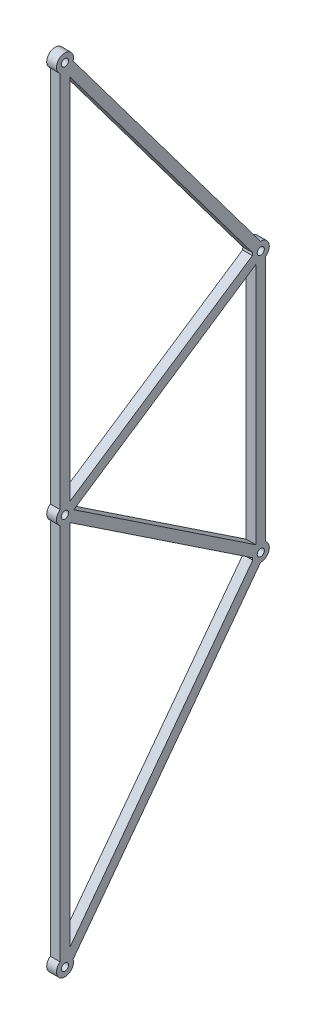
ISO-10303-21;
HEADER;
FILE_DESCRIPTION(('STEP AP214'),'2;1');
FILE_NAME('part.step','',(''),(''),'','','');
FILE_SCHEMA(('AUTOMOTIVE_DESIGN { 1 0 10303 214 1 1 1 1 }'));
ENDSEC;
DATA;
#1=APPLICATION_CONTEXT('core data for automotive mechanical design processes');
#2=APPLICATION_PROTOCOL_DEFINITION('international standard','automotive_design',2000,#1);
#3=PRODUCT_CONTEXT('',#1,'mechanical');
#4=PRODUCT('Part','Part','',(#3));
#5=PRODUCT_RELATED_PRODUCT_CATEGORY('part','',(#4));
#6=PRODUCT_DEFINITION_FORMATION('','',#4);
#7=PRODUCT_DEFINITION_CONTEXT('part definition',#1,'design');
#8=PRODUCT_DEFINITION('design','',#6,#7);
#9=PRODUCT_DEFINITION_SHAPE('','',#8);
#10=(LENGTH_UNIT() NAMED_UNIT(*) SI_UNIT(.MILLI.,.METRE.));
#11=(NAMED_UNIT(*) PLANE_ANGLE_UNIT() SI_UNIT($,.RADIAN.));
#12=(NAMED_UNIT(*) SI_UNIT($,.STERADIAN.) SOLID_ANGLE_UNIT());
#13=UNCERTAINTY_MEASURE_WITH_UNIT(LENGTH_MEASURE(1.E-05),#10,'distance_accuracy_value','');
#14=(GEOMETRIC_REPRESENTATION_CONTEXT(3) GLOBAL_UNCERTAINTY_ASSIGNED_CONTEXT((#13)) GLOBAL_UNIT_ASSIGNED_CONTEXT((#10,
#11,#12)) REPRESENTATION_CONTEXT('',''));
#15=CARTESIAN_POINT('',(0.,0.,0.));
#16=DIRECTION('',(0.,0.,1.));
#17=DIRECTION('',(1.,0.,0.));
#18=AXIS2_PLACEMENT_3D('',#15,#16,#17);
#19=CARTESIAN_POINT('',(15.,600.,307.5));
#20=DIRECTION('',(0.,0.,-1.));
#21=DIRECTION('',(-1.,0.,0.));
#22=AXIS2_PLACEMENT_3D('',#19,#20,#21);
#23=PLANE('',#22);
#24=DIRECTION('',(0.,-1.,0.));
#25=VECTOR('',#24,1.);
#26=CARTESIAN_POINT('',(15.,1222.5,307.5));
#27=LINE('',#26,#25);
#28=CARTESIAN_POINT('',(15.,1189.3816197092,307.5));
#29=VERTEX_POINT('',#28);
#30=CARTESIAN_POINT('',(15.,610.618380290798,307.5));
#31=VERTEX_POINT('',#30);
#32=EDGE_CURVE('E348',#29,#31,#27,.T.);
#33=ORIENTED_EDGE('',*,*,#32,.F.);
#34=DIRECTION('',(1.,0.,0.));
#35=VECTOR('',#34,1.);
#36=CARTESIAN_POINT('',(0.,1189.3816197092,307.5));
#37=LINE('',#36,#35);
#38=CARTESIAN_POINT('',(0.,1189.3816197092,307.5));
#39=VERTEX_POINT('',#38);
#40=EDGE_CURVE('E255',#29,#39,#37,.F.);
#41=ORIENTED_EDGE('',*,*,#40,.T.);
#42=DIRECTION('',(0.,-1.,0.));
#43=VECTOR('',#42,1.);
#44=CARTESIAN_POINT('',(0.,600.,307.5));
#45=LINE('',#44,#43);
#46=CARTESIAN_POINT('',(0.,610.618380290798,307.5));
#47=VERTEX_POINT('',#46);
#48=EDGE_CURVE('E363',#39,#47,#45,.T.);
#49=ORIENTED_EDGE('',*,*,#48,.T.);
#50=DIRECTION('',(1.,0.,0.));
#51=VECTOR('',#50,1.);
#52=CARTESIAN_POINT('',(0.,610.618380290798,307.5));
#53=LINE('',#52,#51);
#54=EDGE_CURVE('E11',#47,#31,#53,.T.);
#55=ORIENTED_EDGE('',*,*,#54,.T.);
#56=EDGE_LOOP('',(#33,#41,#49,#55));
#57=FACE_BOUND('',#56,.T.);
#58=ADVANCED_FACE('F45',(#57),#23,.F.);
#59=CARTESIAN_POINT('',(15.,589.381619709202,307.5));
#60=VERTEX_POINT('',#59);
#61=CARTESIAN_POINT('',(15.,10.6183802907976,307.5));
#62=VERTEX_POINT('',#61);
#63=EDGE_CURVE('E345',#60,#62,#27,.T.);
#64=ORIENTED_EDGE('',*,*,#63,.F.);
#65=DIRECTION('',(1.,0.,0.));
#66=VECTOR('',#65,1.);
#67=CARTESIAN_POINT('',(0.,589.381619709202,307.5));
#68=LINE('',#67,#66);
#69=CARTESIAN_POINT('',(0.,589.381619709202,307.5));
#70=VERTEX_POINT('',#69);
#71=EDGE_CURVE('E53',#60,#70,#68,.F.);
#72=ORIENTED_EDGE('',*,*,#71,.T.);
#73=CARTESIAN_POINT('',(0.,10.6183802907976,307.5));
#74=VERTEX_POINT('',#73);
#75=EDGE_CURVE('E344',#70,#74,#45,.T.);
#76=ORIENTED_EDGE('',*,*,#75,.T.);
#77=DIRECTION('',(1.,0.,0.));
#78=VECTOR('',#77,1.);
#79=CARTESIAN_POINT('',(0.,10.6183802907976,307.5));
#80=LINE('',#79,#78);
#81=EDGE_CURVE('E259',#74,#62,#80,.T.);
#82=ORIENTED_EDGE('',*,*,#81,.T.);
#83=EDGE_LOOP('',(#64,#72,#76,#82));
#84=FACE_BOUND('',#83,.T.);
#85=ADVANCED_FACE('F390',(#84),#23,.F.);
#86=CARTESIAN_POINT('',(15.,804.5,-6.));
#87=DIRECTION('',(0.,-0.6,0.8));
#88=DIRECTION('',(0.,-0.8,-0.6));
#89=AXIS2_PLACEMENT_3D('',#86,#87,#88);
#90=PLANE('',#89);
#91=DIRECTION('',(0.,0.8,0.6));
#92=VECTOR('',#91,1.);
#93=CARTESIAN_POINT('',(0.,804.5,-6.));
#94=LINE('',#93,#92);
#95=CARTESIAN_POINT('',(0.,812.994704232638,0.371028174478654));
#96=VERTEX_POINT('',#95);
#97=CARTESIAN_POINT('',(0.,1196.00529576736,287.628971825522));
#98=VERTEX_POINT('',#97);
#99=EDGE_CURVE('E349',#96,#98,#94,.T.);
#100=ORIENTED_EDGE('',*,*,#99,.T.);
#101=DIRECTION('',(1.,0.,0.));
#102=VECTOR('',#101,1.);
#103=CARTESIAN_POINT('',(0.,1196.00529576736,287.628971825522));
#104=LINE('',#103,#102);
#105=CARTESIAN_POINT('',(15.,1196.00529576736,287.628971825522));
#106=VERTEX_POINT('',#105);
#107=EDGE_CURVE('E378',#98,#106,#104,.T.);
#108=ORIENTED_EDGE('',*,*,#107,.T.);
#109=DIRECTION('',(0.,0.8,0.6));
#110=VECTOR('',#109,1.);
#111=CARTESIAN_POINT('',(15.,804.5,-6.));
#112=LINE('',#111,#110);
#113=CARTESIAN_POINT('',(15.,812.994704232638,0.371028174478655));
#114=VERTEX_POINT('',#113);
#115=EDGE_CURVE('E212',#114,#106,#112,.T.);
#116=ORIENTED_EDGE('',*,*,#115,.F.);
#117=DIRECTION('',(1.,0.,0.));
#118=VECTOR('',#117,1.);
#119=CARTESIAN_POINT('',(0.,812.994704232638,0.371028174478661));
#120=LINE('',#119,#118);
#121=EDGE_CURVE('E234',#114,#96,#120,.F.);
#122=ORIENTED_EDGE('',*,*,#121,.T.);
#123=EDGE_LOOP('',(#100,#108,#116,#122));
#124=FACE_BOUND('',#123,.T.);
#125=ADVANCED_FACE('F454',(#124),#90,.F.);
#126=CARTESIAN_POINT('',(15.,400.,0.));
#127=DIRECTION('',(1.,0.,0.));
#128=DIRECTION('',(0.,0.,-1.));
#129=AXIS2_PLACEMENT_3D('',#126,#127,#128);
#130=PLANE('',#129);
#131=CARTESIAN_POINT('',(15.,0.,300.));
#132=DIRECTION('',(1.,0.,0.));
#133=DIRECTION('',(0.,0.,-1.));
#134=AXIS2_PLACEMENT_3D('',#131,#132,#133);
#135=CIRCLE('',#134,5.5);
#136=CARTESIAN_POINT('',(15.,0.,294.5));
#137=VERTEX_POINT('',#136);
#138=EDGE_CURVE('E498',#137,#137,#135,.T.);
#139=ORIENTED_EDGE('',*,*,#138,.F.);
#140=EDGE_LOOP('',(#139));
#141=FACE_BOUND('',#140,.T.);
#142=CARTESIAN_POINT('',(15.,600.,300.));
#143=DIRECTION('',(1.,0.,0.));
#144=DIRECTION('',(0.,0.,-1.));
#145=AXIS2_PLACEMENT_3D('',#142,#143,#144);
#146=CIRCLE('',#145,5.49999999999996);
#147=CARTESIAN_POINT('',(15.,600.,294.5));
#148=VERTEX_POINT('',#147);
#149=EDGE_CURVE('E494',#148,#148,#146,.T.);
#150=ORIENTED_EDGE('',*,*,#149,.F.);
#151=EDGE_LOOP('',(#150));
#152=FACE_BOUND('',#151,.T.);
#153=CARTESIAN_POINT('',(15.,1200.,300.));
#154=DIRECTION('',(1.,0.,0.));
#155=DIRECTION('',(0.,0.,-1.));
#156=AXIS2_PLACEMENT_3D('',#153,#154,#155);
#157=CIRCLE('',#156,5.50000000000007);
#158=CARTESIAN_POINT('',(15.,1200.,294.5));
#159=VERTEX_POINT('',#158);
#160=EDGE_CURVE('E486',#159,#159,#157,.T.);
#161=ORIENTED_EDGE('',*,*,#160,.F.);
#162=EDGE_LOOP('',(#161));
#163=FACE_BOUND('',#162,.T.);
#164=CARTESIAN_POINT('',(15.,800.,0.));
#165=DIRECTION('',(1.,0.,0.));
#166=DIRECTION('',(0.,0.,-1.));
#167=AXIS2_PLACEMENT_3D('',#164,#165,#166);
#168=CIRCLE('',#167,5.49999999999996);
#169=CARTESIAN_POINT('',(15.,800.,-5.49999999999996));
#170=VERTEX_POINT('',#169);
#171=EDGE_CURVE('E478',#170,#170,#168,.T.);
#172=ORIENTED_EDGE('',*,*,#171,.F.);
#173=EDGE_LOOP('',(#172));
#174=FACE_BOUND('',#173,.T.);
#175=CARTESIAN_POINT('',(15.,400.,0.));
#176=DIRECTION('',(1.,0.,0.));
#177=DIRECTION('',(0.,0.,-1.));
#178=AXIS2_PLACEMENT_3D('',#175,#176,#177);
#179=CIRCLE('',#178,5.50000000000002);
#180=CARTESIAN_POINT('',(15.,400.,-5.50000000000002));
#181=VERTEX_POINT('',#180);
#182=EDGE_CURVE('E470',#181,#181,#179,.T.);
#183=ORIENTED_EDGE('',*,*,#182,.F.);
#184=EDGE_LOOP('',(#183));
#185=FACE_BOUND('',#184,.T.);
#186=CARTESIAN_POINT('',(15.,0.,300.));
#187=DIRECTION('',(1.,0.,0.));
#188=DIRECTION('',(0.,0.,-1.));
#189=AXIS2_PLACEMENT_3D('',#186,#187,#188);
#190=CIRCLE('',#189,13.);
#191=CARTESIAN_POINT('',(15.,3.99470423263813,287.628971825521));
#192=VERTEX_POINT('',#191);
#193=EDGE_CURVE('E406',#62,#192,#190,.T.);
#194=ORIENTED_EDGE('',*,*,#193,.T.);
#195=DIRECTION('',(0.,0.8,-0.6));
#196=VECTOR('',#195,1.);
#197=CARTESIAN_POINT('',(15.,-22.5,307.5));
#198=LINE('',#197,#196);
#199=CARTESIAN_POINT('',(15.,387.005295767362,0.371028174478605));
#200=VERTEX_POINT('',#199);
#201=EDGE_CURVE('E350',#192,#200,#198,.T.);
#202=ORIENTED_EDGE('',*,*,#201,.T.);
#203=CARTESIAN_POINT('',(15.,400.,0.));
#204=DIRECTION('',(1.,0.,0.));
#205=DIRECTION('',(0.,0.,-1.));
#206=AXIS2_PLACEMENT_3D('',#203,#204,#205);
#207=CIRCLE('',#206,13.);
#208=CARTESIAN_POINT('',(15.,410.618380290798,-7.5));
#209=VERTEX_POINT('',#208);
#210=EDGE_CURVE('E413',#200,#209,#207,.T.);
#211=ORIENTED_EDGE('',*,*,#210,.T.);
#212=DIRECTION('',(0.,1.,0.));
#213=VECTOR('',#212,1.);
#214=CARTESIAN_POINT('',(15.,400.,-7.5));
#215=LINE('',#214,#213);
#216=CARTESIAN_POINT('',(15.,789.381619709202,-7.5));
#217=VERTEX_POINT('',#216);
#218=EDGE_CURVE('E354',#209,#217,#215,.T.);
#219=ORIENTED_EDGE('',*,*,#218,.T.);
#220=CARTESIAN_POINT('',(15.,800.,0.));
#221=DIRECTION('',(1.,0.,0.));
#222=DIRECTION('',(0.,0.,-1.));
#223=AXIS2_PLACEMENT_3D('',#220,#221,#222);
#224=CIRCLE('',#223,13.);
#225=EDGE_CURVE('E219',#217,#114,#224,.T.);
#226=ORIENTED_EDGE('',*,*,#225,.T.);
#227=ORIENTED_EDGE('',*,*,#115,.T.);
#228=CARTESIAN_POINT('',(15.,1200.,300.));
#229=DIRECTION('',(1.,0.,0.));
#230=DIRECTION('',(0.,0.,-1.));
#231=AXIS2_PLACEMENT_3D('',#228,#229,#230);
#232=CIRCLE('',#231,12.9999999999998);
#233=EDGE_CURVE('E66',#106,#29,#232,.T.);
#234=ORIENTED_EDGE('',*,*,#233,.T.);
#235=ORIENTED_EDGE('',*,*,#32,.T.);
#236=CARTESIAN_POINT('',(15.,600.,300.));
#237=DIRECTION('',(1.,0.,0.));
#238=DIRECTION('',(0.,0.,-1.));
#239=AXIS2_PLACEMENT_3D('',#236,#237,#238);
#240=CIRCLE('',#239,13.);
#241=EDGE_CURVE('E60',#31,#60,#240,.T.);
#242=ORIENTED_EDGE('',*,*,#241,.T.);
#243=ORIENTED_EDGE('',*,*,#63,.T.);
#244=EDGE_LOOP('',(#194,#202,#211,#219,#226,#227,#234,#235,#242,#243));
#245=FACE_BOUND('',#244,.T.);
#246=DIRECTION('',(0.,0.554700196225229,0.832050294337844));
#247=VECTOR('',#246,1.);
#248=CARTESIAN_POINT('',(15.,398.157414540893,10.75693909433));
#249=LINE('',#248,#247);
#250=CARTESIAN_POINT('',(15.,399.649640423366,12.9952779180386));
#251=VERTEX_POINT('',#250);
#252=CARTESIAN_POINT('',(15.,585.98612181134,292.5));
#253=VERTEX_POINT('',#252);
#254=EDGE_CURVE('E287',#251,#253,#249,.T.);
#255=ORIENTED_EDGE('',*,*,#254,.F.);
#256=CARTESIAN_POINT('',(15.,396.005295767362,12.3710281744786));
#257=VERTEX_POINT('',#256);
#258=EDGE_CURVE('E407',#251,#257,#207,.T.);
#259=ORIENTED_EDGE('',*,*,#258,.T.);
#260=DIRECTION('',(0.,0.8,-0.6));
#261=VECTOR('',#260,1.);
#262=CARTESIAN_POINT('',(15.,22.5,292.5));
#263=LINE('',#262,#261);
#264=CARTESIAN_POINT('',(15.,22.5,292.5));
#265=VERTEX_POINT('',#264);
#266=EDGE_CURVE('E284',#265,#257,#263,.T.);
#267=ORIENTED_EDGE('',*,*,#266,.F.);
#268=DIRECTION('',(0.,-1.,0.));
#269=VECTOR('',#268,1.);
#270=CARTESIAN_POINT('',(15.,585.98612181134,292.5));
#271=LINE('',#270,#269);
#272=EDGE_CURVE('E291',#253,#265,#271,.T.);
#273=ORIENTED_EDGE('',*,*,#272,.F.);
#274=EDGE_LOOP('',(#255,#259,#267,#273));
#275=FACE_BOUND('',#274,.T.);
#276=DIRECTION('',(0.,0.8,0.6));
#277=VECTOR('',#276,1.);
#278=CARTESIAN_POINT('',(15.,801.842585459107,10.7569390943299));
#279=LINE('',#278,#277);
#280=CARTESIAN_POINT('',(15.,803.994704232638,12.3710281744786));
#281=VERTEX_POINT('',#280);
#282=CARTESIAN_POINT('',(15.,1177.5,292.5));
#283=VERTEX_POINT('',#282);
#284=EDGE_CURVE('E188',#281,#283,#279,.T.);
#285=ORIENTED_EDGE('',*,*,#284,.F.);
#286=CARTESIAN_POINT('',(15.,800.350359576634,12.9952779180386));
#287=VERTEX_POINT('',#286);
#288=EDGE_CURVE('E194',#281,#287,#224,.T.);
#289=ORIENTED_EDGE('',*,*,#288,.T.);
#290=DIRECTION('',(0.,0.554700196225229,-0.832050294337844));
#291=VECTOR('',#290,1.);
#292=CARTESIAN_POINT('',(15.,801.842585459107,10.7569390943299));
#293=LINE('',#292,#291);
#294=CARTESIAN_POINT('',(15.,614.01387818866,292.5));
#295=VERTEX_POINT('',#294);
#296=EDGE_CURVE('E201',#295,#287,#293,.T.);
#297=ORIENTED_EDGE('',*,*,#296,.F.);
#298=DIRECTION('',(0.,-1.,0.));
#299=VECTOR('',#298,1.);
#300=CARTESIAN_POINT('',(15.,1177.5,292.5));
#301=LINE('',#300,#299);
#302=EDGE_CURVE('E195',#283,#295,#301,.T.);
#303=ORIENTED_EDGE('',*,*,#302,.F.);
#304=EDGE_LOOP('',(#285,#289,#297,#303));
#305=FACE_BOUND('',#304,.T.);
#306=DIRECTION('',(0.,-0.55470019622523,0.832050294337843));
#307=VECTOR('',#306,1.);
#308=CARTESIAN_POINT('',(15.,785.98612181134,7.49999999999998));
#309=LINE('',#308,#307);
#310=CARTESIAN_POINT('',(15.,785.98612181134,7.49999999999998));
#311=VERTEX_POINT('',#310);
#312=CARTESIAN_POINT('',(15.,600.,286.47918271701));
#313=VERTEX_POINT('',#312);
#314=EDGE_CURVE('E315',#311,#313,#309,.T.);
#315=ORIENTED_EDGE('',*,*,#314,.F.);
#316=DIRECTION('',(0.,1.,0.));
#317=VECTOR('',#316,1.);
#318=CARTESIAN_POINT('',(15.,414.01387818866,7.5));
#319=LINE('',#318,#317);
#320=CARTESIAN_POINT('',(15.,414.01387818866,7.5));
#321=VERTEX_POINT('',#320);
#322=EDGE_CURVE('E312',#321,#311,#319,.T.);
#323=ORIENTED_EDGE('',*,*,#322,.F.);
#324=DIRECTION('',(0.,-0.554700196225229,-0.832050294337844));
#325=VECTOR('',#324,1.);
#326=CARTESIAN_POINT('',(15.,414.01387818866,7.5));
#327=LINE('',#326,#325);
#328=EDGE_CURVE('E320',#313,#321,#327,.T.);
#329=ORIENTED_EDGE('',*,*,#328,.F.);
#330=EDGE_LOOP('',(#315,#323,#329));
#331=FACE_BOUND('',#330,.T.);
#332=ADVANCED_FACE('F190',(#141,#152,#163,#174,#185,#245,#275,#305,#331),#130,.T.);
#333=CARTESIAN_POINT('',(0.,400.,0.));
#334=DIRECTION('',(1.,0.,0.));
#335=DIRECTION('',(0.,0.,-1.));
#336=AXIS2_PLACEMENT_3D('',#333,#334,#335);
#337=PLANE('',#336);
#338=CARTESIAN_POINT('',(0.,0.,300.));
#339=DIRECTION('',(1.,0.,0.));
#340=DIRECTION('',(0.,0.,-1.));
#341=AXIS2_PLACEMENT_3D('',#338,#339,#340);
#342=CIRCLE('',#341,5.5);
#343=CARTESIAN_POINT('',(0.,0.,294.5));
#344=VERTEX_POINT('',#343);
#345=EDGE_CURVE('E231',#344,#344,#342,.T.);
#346=ORIENTED_EDGE('',*,*,#345,.T.);
#347=EDGE_LOOP('',(#346));
#348=FACE_BOUND('',#347,.T.);
#349=CARTESIAN_POINT('',(0.,600.,300.));
#350=DIRECTION('',(1.,0.,0.));
#351=DIRECTION('',(0.,0.,-1.));
#352=AXIS2_PLACEMENT_3D('',#349,#350,#351);
#353=CIRCLE('',#352,5.49999999999996);
#354=CARTESIAN_POINT('',(0.,600.,294.5));
#355=VERTEX_POINT('',#354);
#356=EDGE_CURVE('E490',#355,#355,#353,.T.);
#357=ORIENTED_EDGE('',*,*,#356,.T.);
#358=EDGE_LOOP('',(#357));
#359=FACE_BOUND('',#358,.T.);
#360=CARTESIAN_POINT('',(0.,1200.,300.));
#361=DIRECTION('',(1.,0.,0.));
#362=DIRECTION('',(0.,0.,-1.));
#363=AXIS2_PLACEMENT_3D('',#360,#361,#362);
#364=CIRCLE('',#363,5.50000000000007);
#365=CARTESIAN_POINT('',(0.,1200.,294.5));
#366=VERTEX_POINT('',#365);
#367=EDGE_CURVE('E482',#366,#366,#364,.T.);
#368=ORIENTED_EDGE('',*,*,#367,.T.);
#369=EDGE_LOOP('',(#368));
#370=FACE_BOUND('',#369,.T.);
#371=CARTESIAN_POINT('',(0.,800.,0.));
#372=DIRECTION('',(1.,0.,0.));
#373=DIRECTION('',(0.,0.,-1.));
#374=AXIS2_PLACEMENT_3D('',#371,#372,#373);
#375=CIRCLE('',#374,5.49999999999996);
#376=CARTESIAN_POINT('',(0.,800.,-5.49999999999996));
#377=VERTEX_POINT('',#376);
#378=EDGE_CURVE('E474',#377,#377,#375,.T.);
#379=ORIENTED_EDGE('',*,*,#378,.T.);
#380=EDGE_LOOP('',(#379));
#381=FACE_BOUND('',#380,.T.);
#382=CARTESIAN_POINT('',(0.,400.,0.));
#383=DIRECTION('',(1.,0.,0.));
#384=DIRECTION('',(0.,0.,-1.));
#385=AXIS2_PLACEMENT_3D('',#382,#383,#384);
#386=CIRCLE('',#385,5.50000000000002);
#387=CARTESIAN_POINT('',(0.,400.,-5.50000000000002));
#388=VERTEX_POINT('',#387);
#389=EDGE_CURVE('E466',#388,#388,#386,.T.);
#390=ORIENTED_EDGE('',*,*,#389,.T.);
#391=EDGE_LOOP('',(#390));
#392=FACE_BOUND('',#391,.T.);
#393=DIRECTION('',(0.,0.8,-0.6));
#394=VECTOR('',#393,1.);
#395=CARTESIAN_POINT('',(0.,-22.5,307.5));
#396=LINE('',#395,#394);
#397=CARTESIAN_POINT('',(0.,3.99470423263812,287.628971825521));
#398=VERTEX_POINT('',#397);
#399=CARTESIAN_POINT('',(0.,387.005295767362,0.371028174478605));
#400=VERTEX_POINT('',#399);
#401=EDGE_CURVE('E364',#398,#400,#396,.T.);
#402=ORIENTED_EDGE('',*,*,#401,.F.);
#403=CARTESIAN_POINT('',(0.,0.,300.));
#404=DIRECTION('',(1.,0.,0.));
#405=DIRECTION('',(0.,0.,-1.));
#406=AXIS2_PLACEMENT_3D('',#403,#404,#405);
#407=CIRCLE('',#406,13.);
#408=EDGE_CURVE('E401',#74,#398,#407,.T.);
#409=ORIENTED_EDGE('',*,*,#408,.F.);
#410=ORIENTED_EDGE('',*,*,#75,.F.);
#411=CARTESIAN_POINT('',(0.,600.,300.));
#412=DIRECTION('',(1.,0.,0.));
#413=DIRECTION('',(0.,0.,-1.));
#414=AXIS2_PLACEMENT_3D('',#411,#412,#413);
#415=CIRCLE('',#414,13.);
#416=EDGE_CURVE('E399',#47,#70,#415,.T.);
#417=ORIENTED_EDGE('',*,*,#416,.F.);
#418=ORIENTED_EDGE('',*,*,#48,.F.);
#419=CARTESIAN_POINT('',(0.,1200.,300.));
#420=DIRECTION('',(1.,0.,0.));
#421=DIRECTION('',(0.,0.,-1.));
#422=AXIS2_PLACEMENT_3D('',#419,#420,#421);
#423=CIRCLE('',#422,12.9999999999998);
#424=EDGE_CURVE('E235',#98,#39,#423,.T.);
#425=ORIENTED_EDGE('',*,*,#424,.F.);
#426=ORIENTED_EDGE('',*,*,#99,.F.);
#427=CARTESIAN_POINT('',(0.,800.,0.));
#428=DIRECTION('',(1.,0.,0.));
#429=DIRECTION('',(0.,0.,-1.));
#430=AXIS2_PLACEMENT_3D('',#427,#428,#429);
#431=CIRCLE('',#430,13.);
#432=CARTESIAN_POINT('',(0.,789.381619709202,-7.5));
#433=VERTEX_POINT('',#432);
#434=EDGE_CURVE('E228',#433,#96,#431,.T.);
#435=ORIENTED_EDGE('',*,*,#434,.F.);
#436=DIRECTION('',(0.,1.,0.));
#437=VECTOR('',#436,1.);
#438=CARTESIAN_POINT('',(0.,400.,-7.5));
#439=LINE('',#438,#437);
#440=CARTESIAN_POINT('',(0.,410.618380290798,-7.5));
#441=VERTEX_POINT('',#440);
#442=EDGE_CURVE('E368',#441,#433,#439,.T.);
#443=ORIENTED_EDGE('',*,*,#442,.F.);
#444=CARTESIAN_POINT('',(0.,400.,0.));
#445=DIRECTION('',(1.,0.,0.));
#446=DIRECTION('',(0.,0.,-1.));
#447=AXIS2_PLACEMENT_3D('',#444,#445,#446);
#448=CIRCLE('',#447,13.);
#449=EDGE_CURVE('E218',#400,#441,#448,.T.);
#450=ORIENTED_EDGE('',*,*,#449,.F.);
#451=EDGE_LOOP('',(#402,#409,#410,#417,#418,#425,#426,#435,#443,#450));
#452=FACE_BOUND('',#451,.T.);
#453=CARTESIAN_POINT('',(0.,399.649640423366,12.9952779180386));
#454=VERTEX_POINT('',#453);
#455=CARTESIAN_POINT('',(0.,396.005295767362,12.3710281744786));
#456=VERTEX_POINT('',#455);
#457=EDGE_CURVE('E223',#454,#456,#448,.T.);
#458=ORIENTED_EDGE('',*,*,#457,.F.);
#459=DIRECTION('',(0.,0.554700196225229,0.832050294337844));
#460=VECTOR('',#459,1.);
#461=CARTESIAN_POINT('',(0.,398.157414540893,10.75693909433));
#462=LINE('',#461,#460);
#463=CARTESIAN_POINT('',(0.,585.98612181134,292.5));
#464=VERTEX_POINT('',#463);
#465=EDGE_CURVE('E298',#454,#464,#462,.T.);
#466=ORIENTED_EDGE('',*,*,#465,.T.);
#467=DIRECTION('',(0.,-1.,0.));
#468=VECTOR('',#467,1.);
#469=CARTESIAN_POINT('',(0.,585.98612181134,292.5));
#470=LINE('',#469,#468);
#471=CARTESIAN_POINT('',(0.,22.5,292.5));
#472=VERTEX_POINT('',#471);
#473=EDGE_CURVE('E288',#464,#472,#470,.T.);
#474=ORIENTED_EDGE('',*,*,#473,.T.);
#475=DIRECTION('',(0.,0.8,-0.6));
#476=VECTOR('',#475,1.);
#477=CARTESIAN_POINT('',(0.,22.5,292.5));
#478=LINE('',#477,#476);
#479=EDGE_CURVE('E283',#472,#456,#478,.T.);
#480=ORIENTED_EDGE('',*,*,#479,.T.);
#481=EDGE_LOOP('',(#458,#466,#474,#480));
#482=FACE_BOUND('',#481,.T.);
#483=CARTESIAN_POINT('',(0.,803.994704232638,12.3710281744786));
#484=VERTEX_POINT('',#483);
#485=CARTESIAN_POINT('',(0.,800.350359576634,12.9952779180386));
#486=VERTEX_POINT('',#485);
#487=EDGE_CURVE('E225',#484,#486,#431,.T.);
#488=ORIENTED_EDGE('',*,*,#487,.F.);
#489=DIRECTION('',(0.,0.8,0.6));
#490=VECTOR('',#489,1.);
#491=CARTESIAN_POINT('',(0.,801.842585459107,10.7569390943299));
#492=LINE('',#491,#490);
#493=CARTESIAN_POINT('',(0.,1177.5,292.5));
#494=VERTEX_POINT('',#493);
#495=EDGE_CURVE('E206',#484,#494,#492,.T.);
#496=ORIENTED_EDGE('',*,*,#495,.T.);
#497=DIRECTION('',(0.,-1.,0.));
#498=VECTOR('',#497,1.);
#499=CARTESIAN_POINT('',(0.,1177.5,292.5));
#500=LINE('',#499,#498);
#501=CARTESIAN_POINT('',(0.,614.01387818866,292.5));
#502=VERTEX_POINT('',#501);
#503=EDGE_CURVE('E263',#494,#502,#500,.T.);
#504=ORIENTED_EDGE('',*,*,#503,.T.);
#505=DIRECTION('',(0.,0.554700196225229,-0.832050294337844));
#506=VECTOR('',#505,1.);
#507=CARTESIAN_POINT('',(0.,801.842585459107,10.7569390943299));
#508=LINE('',#507,#506);
#509=EDGE_CURVE('E271',#502,#486,#508,.T.);
#510=ORIENTED_EDGE('',*,*,#509,.T.);
#511=EDGE_LOOP('',(#488,#496,#504,#510));
#512=FACE_BOUND('',#511,.T.);
#513=DIRECTION('',(0.,1.,0.));
#514=VECTOR('',#513,1.);
#515=CARTESIAN_POINT('',(0.,414.01387818866,7.5));
#516=LINE('',#515,#514);
#517=CARTESIAN_POINT('',(0.,414.01387818866,7.5));
#518=VERTEX_POINT('',#517);
#519=CARTESIAN_POINT('',(0.,785.98612181134,7.49999999999998));
#520=VERTEX_POINT('',#519);
#521=EDGE_CURVE('E311',#518,#520,#516,.T.);
#522=ORIENTED_EDGE('',*,*,#521,.T.);
#523=DIRECTION('',(0.,-0.55470019622523,0.832050294337843));
#524=VECTOR('',#523,1.);
#525=CARTESIAN_POINT('',(0.,785.98612181134,7.49999999999998));
#526=LINE('',#525,#524);
#527=CARTESIAN_POINT('',(0.,600.,286.47918271701));
#528=VERTEX_POINT('',#527);
#529=EDGE_CURVE('E327',#520,#528,#526,.T.);
#530=ORIENTED_EDGE('',*,*,#529,.T.);
#531=DIRECTION('',(0.,-0.554700196225229,-0.832050294337844));
#532=VECTOR('',#531,1.);
#533=CARTESIAN_POINT('',(0.,414.01387818866,7.5));
#534=LINE('',#533,#532);
#535=EDGE_CURVE('E316',#528,#518,#534,.T.);
#536=ORIENTED_EDGE('',*,*,#535,.T.);
#537=EDGE_LOOP('',(#522,#530,#536));
#538=FACE_BOUND('',#537,.T.);
#539=ADVANCED_FACE('F396',(#348,#359,#370,#381,#392,#452,#482,#512,#538),#337,.F.);
#540=CARTESIAN_POINT('',(15.,-22.5,307.5));
#541=DIRECTION('',(0.,0.6,0.8));
#542=DIRECTION('',(0.,-0.8,0.6));
#543=AXIS2_PLACEMENT_3D('',#540,#541,#542);
#544=PLANE('',#543);
#545=ORIENTED_EDGE('',*,*,#201,.F.);
#546=DIRECTION('',(1.,0.,0.));
#547=VECTOR('',#546,1.);
#548=CARTESIAN_POINT('',(0.,3.99470423263812,287.628971825521));
#549=LINE('',#548,#547);
#550=EDGE_CURVE('E382',#192,#398,#549,.F.);
#551=ORIENTED_EDGE('',*,*,#550,.T.);
#552=ORIENTED_EDGE('',*,*,#401,.T.);
#553=DIRECTION('',(1.,0.,0.));
#554=VECTOR('',#553,1.);
#555=CARTESIAN_POINT('',(0.,387.005295767362,0.371028174478605));
#556=LINE('',#555,#554);
#557=EDGE_CURVE('E251',#400,#200,#556,.T.);
#558=ORIENTED_EDGE('',*,*,#557,.T.);
#559=EDGE_LOOP('',(#545,#551,#552,#558));
#560=FACE_BOUND('',#559,.T.);
#561=ADVANCED_FACE('F528',(#560),#544,.F.);
#562=CARTESIAN_POINT('',(15.,400.,-7.5));
#563=DIRECTION('',(0.,0.,1.));
#564=DIRECTION('',(1.,0.,0.));
#565=AXIS2_PLACEMENT_3D('',#562,#563,#564);
#566=PLANE('',#565);
#567=ORIENTED_EDGE('',*,*,#218,.F.);
#568=DIRECTION('',(1.,0.,0.));
#569=VECTOR('',#568,1.);
#570=CARTESIAN_POINT('',(0.,410.618380290798,-7.5));
#571=LINE('',#570,#569);
#572=EDGE_CURVE('E247',#209,#441,#571,.F.);
#573=ORIENTED_EDGE('',*,*,#572,.T.);
#574=ORIENTED_EDGE('',*,*,#442,.T.);
#575=DIRECTION('',(1.,0.,0.));
#576=VECTOR('',#575,1.);
#577=CARTESIAN_POINT('',(0.,789.381619709202,-7.5));
#578=LINE('',#577,#576);
#579=EDGE_CURVE('E239',#433,#217,#578,.T.);
#580=ORIENTED_EDGE('',*,*,#579,.T.);
#581=EDGE_LOOP('',(#567,#573,#574,#580));
#582=FACE_BOUND('',#581,.T.);
#583=ADVANCED_FACE('F536',(#582),#566,.F.);
#584=CARTESIAN_POINT('',(15.,414.01387818866,7.5));
#585=DIRECTION('',(0.,0.,1.));
#586=DIRECTION('',(0.,-1.,0.));
#587=AXIS2_PLACEMENT_3D('',#584,#585,#586);
#588=PLANE('',#587);
#589=ORIENTED_EDGE('',*,*,#521,.F.);
#590=DIRECTION('',(-1.,0.,0.));
#591=VECTOR('',#590,1.);
#592=CARTESIAN_POINT('',(15.,414.01387818866,7.5));
#593=LINE('',#592,#591);
#594=EDGE_CURVE('E323',#321,#518,#593,.T.);
#595=ORIENTED_EDGE('',*,*,#594,.F.);
#596=ORIENTED_EDGE('',*,*,#322,.T.);
#597=DIRECTION('',(-1.,0.,0.));
#598=VECTOR('',#597,1.);
#599=CARTESIAN_POINT('',(15.,785.98612181134,7.49999999999998));
#600=LINE('',#599,#598);
#601=EDGE_CURVE('E340',#311,#520,#600,.T.);
#602=ORIENTED_EDGE('',*,*,#601,.T.);
#603=EDGE_LOOP('',(#589,#595,#596,#602));
#604=FACE_BOUND('',#603,.T.);
#605=ADVANCED_FACE('F582',(#604),#588,.T.);
#606=CARTESIAN_POINT('',(15.,785.98612181134,7.49999999999998));
#607=DIRECTION('',(0.,-0.832050294337843,-0.55470019622523));
#608=DIRECTION('',(0.,0.55470019622523,-0.832050294337843));
#609=AXIS2_PLACEMENT_3D('',#606,#607,#608);
#610=PLANE('',#609);
#611=ORIENTED_EDGE('',*,*,#529,.F.);
#612=ORIENTED_EDGE('',*,*,#601,.F.);
#613=ORIENTED_EDGE('',*,*,#314,.T.);
#614=DIRECTION('',(-1.,0.,0.));
#615=VECTOR('',#614,1.);
#616=CARTESIAN_POINT('',(15.,600.,286.47918271701));
#617=LINE('',#616,#615);
#618=EDGE_CURVE('E337',#313,#528,#617,.T.);
#619=ORIENTED_EDGE('',*,*,#618,.T.);
#620=EDGE_LOOP('',(#611,#612,#613,#619));
#621=FACE_BOUND('',#620,.T.);
#622=ADVANCED_FACE('F589',(#621),#610,.T.);
#623=CARTESIAN_POINT('',(15.,414.01387818866,7.5));
#624=DIRECTION('',(0.,0.832050294337844,-0.554700196225229));
#625=DIRECTION('',(0.,0.554700196225229,0.832050294337844));
#626=AXIS2_PLACEMENT_3D('',#623,#624,#625);
#627=PLANE('',#626);
#628=ORIENTED_EDGE('',*,*,#535,.F.);
#629=ORIENTED_EDGE('',*,*,#618,.F.);
#630=ORIENTED_EDGE('',*,*,#328,.T.);
#631=ORIENTED_EDGE('',*,*,#594,.T.);
#632=EDGE_LOOP('',(#628,#629,#630,#631));
#633=FACE_BOUND('',#632,.T.);
#634=ADVANCED_FACE('F446',(#633),#627,.T.);
#635=CARTESIAN_POINT('',(15.,22.5,292.5));
#636=DIRECTION('',(0.,0.6,0.8));
#637=DIRECTION('',(0.,-0.8,0.6));
#638=AXIS2_PLACEMENT_3D('',#635,#636,#637);
#639=PLANE('',#638);
#640=DIRECTION('',(1.,0.,0.));
#641=VECTOR('',#640,1.);
#642=CARTESIAN_POINT('',(0.,396.005295767362,12.3710281744786));
#643=LINE('',#642,#641);
#644=EDGE_CURVE('E243',#456,#257,#643,.T.);
#645=ORIENTED_EDGE('',*,*,#644,.F.);
#646=ORIENTED_EDGE('',*,*,#479,.F.);
#647=DIRECTION('',(-1.,0.,0.));
#648=VECTOR('',#647,1.);
#649=CARTESIAN_POINT('',(15.,22.5,292.5));
#650=LINE('',#649,#648);
#651=EDGE_CURVE('E294',#265,#472,#650,.T.);
#652=ORIENTED_EDGE('',*,*,#651,.F.);
#653=ORIENTED_EDGE('',*,*,#266,.T.);
#654=EDGE_LOOP('',(#645,#646,#652,#653));
#655=FACE_BOUND('',#654,.T.);
#656=ADVANCED_FACE('F428',(#655),#639,.T.);
#657=CARTESIAN_POINT('',(15.,398.157414540893,10.75693909433));
#658=DIRECTION('',(0.,-0.832050294337844,0.554700196225229));
#659=DIRECTION('',(0.,-0.554700196225229,-0.832050294337844));
#660=AXIS2_PLACEMENT_3D('',#657,#658,#659);
#661=PLANE('',#660);
#662=DIRECTION('',(1.,0.,0.));
#663=VECTOR('',#662,1.);
#664=CARTESIAN_POINT('',(0.,399.649640423366,12.9952779180386));
#665=LINE('',#664,#663);
#666=EDGE_CURVE('E211',#251,#454,#665,.F.);
#667=ORIENTED_EDGE('',*,*,#666,.F.);
#668=ORIENTED_EDGE('',*,*,#254,.T.);
#669=DIRECTION('',(-1.,0.,0.));
#670=VECTOR('',#669,1.);
#671=CARTESIAN_POINT('',(15.,585.98612181134,292.5));
#672=LINE('',#671,#670);
#673=EDGE_CURVE('E307',#253,#464,#672,.T.);
#674=ORIENTED_EDGE('',*,*,#673,.T.);
#675=ORIENTED_EDGE('',*,*,#465,.F.);
#676=EDGE_LOOP('',(#667,#668,#674,#675));
#677=FACE_BOUND('',#676,.T.);
#678=ADVANCED_FACE('F436',(#677),#661,.T.);
#679=CARTESIAN_POINT('',(15.,585.98612181134,292.5));
#680=DIRECTION('',(0.,0.,-1.));
#681=DIRECTION('',(0.,1.,0.));
#682=AXIS2_PLACEMENT_3D('',#679,#680,#681);
#683=PLANE('',#682);
#684=ORIENTED_EDGE('',*,*,#473,.F.);
#685=ORIENTED_EDGE('',*,*,#673,.F.);
#686=ORIENTED_EDGE('',*,*,#272,.T.);
#687=ORIENTED_EDGE('',*,*,#651,.T.);
#688=EDGE_LOOP('',(#684,#685,#686,#687));
#689=FACE_BOUND('',#688,.T.);
#690=ADVANCED_FACE('F431',(#689),#683,.T.);
#691=CARTESIAN_POINT('',(15.,1177.5,292.5));
#692=DIRECTION('',(0.,0.,-1.));
#693=DIRECTION('',(-1.,0.,0.));
#694=AXIS2_PLACEMENT_3D('',#691,#692,#693);
#695=PLANE('',#694);
#696=ORIENTED_EDGE('',*,*,#503,.F.);
#697=DIRECTION('',(-1.,0.,0.));
#698=VECTOR('',#697,1.);
#699=CARTESIAN_POINT('',(15.,1177.5,292.5));
#700=LINE('',#699,#698);
#701=EDGE_CURVE('E200',#283,#494,#700,.T.);
#702=ORIENTED_EDGE('',*,*,#701,.F.);
#703=ORIENTED_EDGE('',*,*,#302,.T.);
#704=DIRECTION('',(-1.,0.,0.));
#705=VECTOR('',#704,1.);
#706=CARTESIAN_POINT('',(15.,614.01387818866,292.5));
#707=LINE('',#706,#705);
#708=EDGE_CURVE('E279',#295,#502,#707,.T.);
#709=ORIENTED_EDGE('',*,*,#708,.T.);
#710=EDGE_LOOP('',(#696,#702,#703,#709));
#711=FACE_BOUND('',#710,.T.);
#712=ADVANCED_FACE('F444',(#711),#695,.T.);
#713=CARTESIAN_POINT('',(15.,801.842585459107,10.7569390943299));
#714=DIRECTION('',(0.,0.832050294337844,0.554700196225229));
#715=DIRECTION('',(0.,-0.554700196225229,0.832050294337844));
#716=AXIS2_PLACEMENT_3D('',#713,#714,#715);
#717=PLANE('',#716);
#718=DIRECTION('',(1.,0.,0.));
#719=VECTOR('',#718,1.);
#720=CARTESIAN_POINT('',(0.,800.350359576634,12.9952779180386));
#721=LINE('',#720,#719);
#722=EDGE_CURVE('E216',#486,#287,#721,.T.);
#723=ORIENTED_EDGE('',*,*,#722,.F.);
#724=ORIENTED_EDGE('',*,*,#509,.F.);
#725=ORIENTED_EDGE('',*,*,#708,.F.);
#726=ORIENTED_EDGE('',*,*,#296,.T.);
#727=EDGE_LOOP('',(#723,#724,#725,#726));
#728=FACE_BOUND('',#727,.T.);
#729=ADVANCED_FACE('F567',(#728),#717,.T.);
#730=CARTESIAN_POINT('',(15.,801.842585459107,10.7569390943299));
#731=DIRECTION('',(0.,-0.6,0.8));
#732=DIRECTION('',(0.,-0.8,-0.6));
#733=AXIS2_PLACEMENT_3D('',#730,#731,#732);
#734=PLANE('',#733);
#735=DIRECTION('',(1.,0.,0.));
#736=VECTOR('',#735,1.);
#737=CARTESIAN_POINT('',(0.,803.994704232638,12.3710281744786));
#738=LINE('',#737,#736);
#739=EDGE_CURVE('E204',#281,#484,#738,.F.);
#740=ORIENTED_EDGE('',*,*,#739,.F.);
#741=ORIENTED_EDGE('',*,*,#284,.T.);
#742=ORIENTED_EDGE('',*,*,#701,.T.);
#743=ORIENTED_EDGE('',*,*,#495,.F.);
#744=EDGE_LOOP('',(#740,#741,#742,#743));
#745=FACE_BOUND('',#744,.T.);
#746=ADVANCED_FACE('F205',(#745),#734,.T.);
#747=CARTESIAN_POINT('',(0.,800.,0.));
#748=DIRECTION('',(1.,0.,0.));
#749=DIRECTION('',(0.,0.,-1.));
#750=AXIS2_PLACEMENT_3D('',#747,#748,#749);
#751=CYLINDRICAL_SURFACE('',#750,13.);
#752=ORIENTED_EDGE('',*,*,#487,.T.);
#753=ORIENTED_EDGE('',*,*,#722,.T.);
#754=ORIENTED_EDGE('',*,*,#288,.F.);
#755=ORIENTED_EDGE('',*,*,#739,.T.);
#756=EDGE_LOOP('',(#752,#753,#754,#755));
#757=FACE_BOUND('',#756,.T.);
#758=ADVANCED_FACE('F215',(#757),#751,.T.);
#759=CARTESIAN_POINT('',(0.,400.,0.));
#760=DIRECTION('',(1.,0.,0.));
#761=DIRECTION('',(0.,0.,-1.));
#762=AXIS2_PLACEMENT_3D('',#759,#760,#761);
#763=CYLINDRICAL_SURFACE('',#762,13.);
#764=ORIENTED_EDGE('',*,*,#457,.T.);
#765=ORIENTED_EDGE('',*,*,#644,.T.);
#766=ORIENTED_EDGE('',*,*,#258,.F.);
#767=ORIENTED_EDGE('',*,*,#666,.T.);
#768=EDGE_LOOP('',(#764,#765,#766,#767));
#769=FACE_BOUND('',#768,.T.);
#770=ADVANCED_FACE('F421',(#769),#763,.T.);
#771=ORIENTED_EDGE('',*,*,#579,.F.);
#772=ORIENTED_EDGE('',*,*,#434,.T.);
#773=ORIENTED_EDGE('',*,*,#121,.F.);
#774=ORIENTED_EDGE('',*,*,#225,.F.);
#775=EDGE_LOOP('',(#771,#772,#773,#774));
#776=FACE_BOUND('',#775,.T.);
#777=ADVANCED_FACE('F540',(#776),#751,.T.);
#778=ORIENTED_EDGE('',*,*,#557,.F.);
#779=ORIENTED_EDGE('',*,*,#449,.T.);
#780=ORIENTED_EDGE('',*,*,#572,.F.);
#781=ORIENTED_EDGE('',*,*,#210,.F.);
#782=EDGE_LOOP('',(#778,#779,#780,#781));
#783=FACE_BOUND('',#782,.T.);
#784=ADVANCED_FACE('F530',(#783),#763,.T.);
#785=CARTESIAN_POINT('',(0.,0.,300.));
#786=DIRECTION('',(1.,0.,0.));
#787=DIRECTION('',(0.,0.,-1.));
#788=AXIS2_PLACEMENT_3D('',#785,#786,#787);
#789=CYLINDRICAL_SURFACE('',#788,13.);
#790=ORIENTED_EDGE('',*,*,#81,.F.);
#791=ORIENTED_EDGE('',*,*,#408,.T.);
#792=ORIENTED_EDGE('',*,*,#550,.F.);
#793=ORIENTED_EDGE('',*,*,#193,.F.);
#794=EDGE_LOOP('',(#790,#791,#792,#793));
#795=FACE_BOUND('',#794,.T.);
#796=ADVANCED_FACE('F526',(#795),#789,.T.);
#797=CARTESIAN_POINT('',(0.,600.,300.));
#798=DIRECTION('',(1.,0.,0.));
#799=DIRECTION('',(0.,0.,-1.));
#800=AXIS2_PLACEMENT_3D('',#797,#798,#799);
#801=CYLINDRICAL_SURFACE('',#800,13.);
#802=ORIENTED_EDGE('',*,*,#54,.F.);
#803=ORIENTED_EDGE('',*,*,#416,.T.);
#804=ORIENTED_EDGE('',*,*,#71,.F.);
#805=ORIENTED_EDGE('',*,*,#241,.F.);
#806=EDGE_LOOP('',(#802,#803,#804,#805));
#807=FACE_BOUND('',#806,.T.);
#808=ADVANCED_FACE('F547',(#807),#801,.T.);
#809=CARTESIAN_POINT('',(0.,1200.,300.));
#810=DIRECTION('',(1.,0.,0.));
#811=DIRECTION('',(0.,0.,-1.));
#812=AXIS2_PLACEMENT_3D('',#809,#810,#811);
#813=CYLINDRICAL_SURFACE('',#812,12.9999999999998);
#814=ORIENTED_EDGE('',*,*,#233,.F.);
#815=ORIENTED_EDGE('',*,*,#107,.F.);
#816=ORIENTED_EDGE('',*,*,#424,.T.);
#817=ORIENTED_EDGE('',*,*,#40,.F.);
#818=EDGE_LOOP('',(#814,#815,#816,#817));
#819=FACE_BOUND('',#818,.T.);
#820=ADVANCED_FACE('F544',(#819),#813,.T.);
#821=CARTESIAN_POINT('',(0.,400.,0.));
#822=DIRECTION('',(1.,0.,0.));
#823=DIRECTION('',(0.,0.,-1.));
#824=AXIS2_PLACEMENT_3D('',#821,#822,#823);
#825=CYLINDRICAL_SURFACE('',#824,5.50000000000002);
#826=ORIENTED_EDGE('',*,*,#389,.F.);
#827=EDGE_LOOP('',(#826));
#828=FACE_BOUND('',#827,.T.);
#829=ORIENTED_EDGE('',*,*,#182,.T.);
#830=EDGE_LOOP('',(#829));
#831=FACE_BOUND('',#830,.T.);
#832=ADVANCED_FACE('F546',(#828,#831),#825,.F.);
#833=CARTESIAN_POINT('',(0.,800.,0.));
#834=DIRECTION('',(1.,0.,0.));
#835=DIRECTION('',(0.,0.,-1.));
#836=AXIS2_PLACEMENT_3D('',#833,#834,#835);
#837=CYLINDRICAL_SURFACE('',#836,5.49999999999996);
#838=ORIENTED_EDGE('',*,*,#378,.F.);
#839=EDGE_LOOP('',(#838));
#840=FACE_BOUND('',#839,.T.);
#841=ORIENTED_EDGE('',*,*,#171,.T.);
#842=EDGE_LOOP('',(#841));
#843=FACE_BOUND('',#842,.T.);
#844=ADVANCED_FACE('F553',(#840,#843),#837,.F.);
#845=CARTESIAN_POINT('',(0.,1200.,300.));
#846=DIRECTION('',(1.,0.,0.));
#847=DIRECTION('',(0.,0.,-1.));
#848=AXIS2_PLACEMENT_3D('',#845,#846,#847);
#849=CYLINDRICAL_SURFACE('',#848,5.50000000000007);
#850=ORIENTED_EDGE('',*,*,#367,.F.);
#851=EDGE_LOOP('',(#850));
#852=FACE_BOUND('',#851,.T.);
#853=ORIENTED_EDGE('',*,*,#160,.T.);
#854=EDGE_LOOP('',(#853));
#855=FACE_BOUND('',#854,.T.);
#856=ADVANCED_FACE('F770',(#852,#855),#849,.F.);
#857=CARTESIAN_POINT('',(0.,600.,300.));
#858=DIRECTION('',(1.,0.,0.));
#859=DIRECTION('',(0.,0.,-1.));
#860=AXIS2_PLACEMENT_3D('',#857,#858,#859);
#861=CYLINDRICAL_SURFACE('',#860,5.49999999999996);
#862=ORIENTED_EDGE('',*,*,#356,.F.);
#863=EDGE_LOOP('',(#862));
#864=FACE_BOUND('',#863,.T.);
#865=ORIENTED_EDGE('',*,*,#149,.T.);
#866=EDGE_LOOP('',(#865));
#867=FACE_BOUND('',#866,.T.);
#868=ADVANCED_FACE('F511',(#864,#867),#861,.F.);
#869=CARTESIAN_POINT('',(0.,0.,300.));
#870=DIRECTION('',(1.,0.,0.));
#871=DIRECTION('',(0.,0.,-1.));
#872=AXIS2_PLACEMENT_3D('',#869,#870,#871);
#873=CYLINDRICAL_SURFACE('',#872,5.5);
#874=ORIENTED_EDGE('',*,*,#345,.F.);
#875=EDGE_LOOP('',(#874));
#876=FACE_BOUND('',#875,.T.);
#877=ORIENTED_EDGE('',*,*,#138,.T.);
#878=EDGE_LOOP('',(#877));
#879=FACE_BOUND('',#878,.T.);
#880=ADVANCED_FACE('F508',(#876,#879),#873,.F.);
#881=CLOSED_SHELL('',(#58,#85,#125,#332,#539,#561,#583,#605,#622,#634,#656,#678,#690,#712,#729,
#746,#758,#770,#777,#784,#796,#808,#820,#832,#844,#856,#868,#880));
#882=MANIFOLD_SOLID_BREP('B2',#881);
#883=ADVANCED_BREP_SHAPE_REPRESENTATION('',(#18,#882),#14);
#884=SHAPE_DEFINITION_REPRESENTATION(#9,#883);
ENDSEC;
END-ISO-10303-21;
